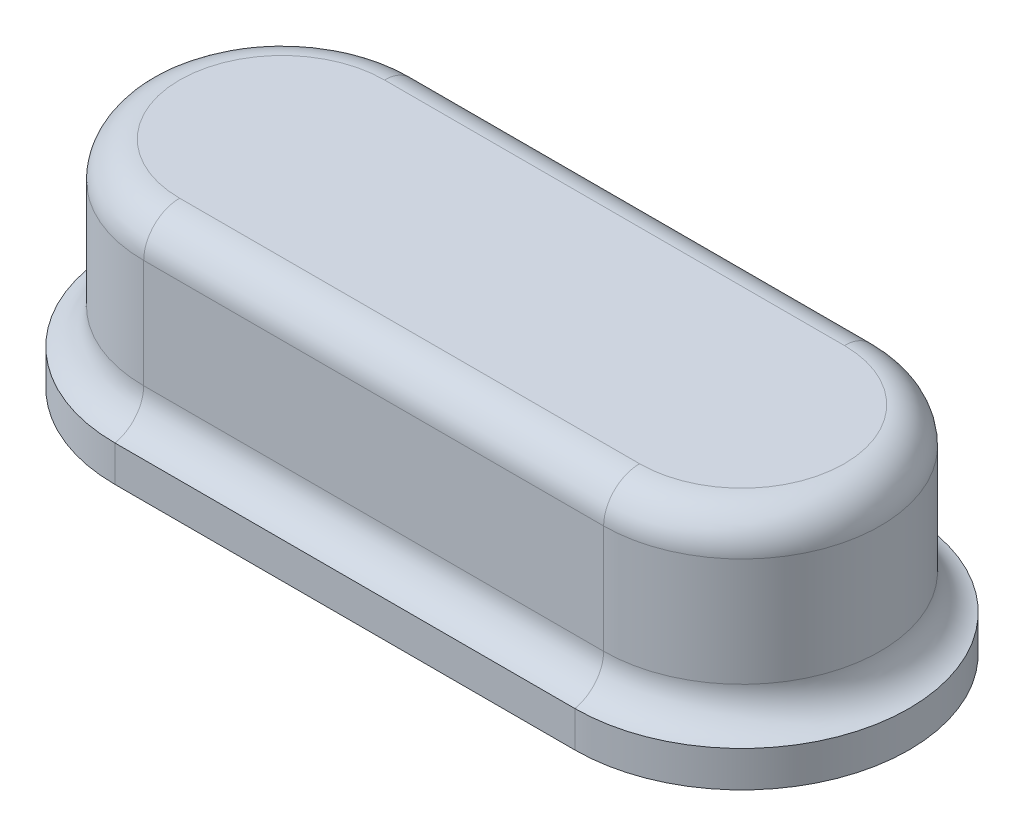
ISO-10303-21;
HEADER;
FILE_DESCRIPTION(('STEP AP214'),'2;1');
FILE_NAME('part.step','',(''),(''),'','','');
FILE_SCHEMA(('AUTOMOTIVE_DESIGN { 1 0 10303 214 1 1 1 1 }'));
ENDSEC;
DATA;
#1=APPLICATION_CONTEXT('core data for automotive mechanical design processes');
#2=APPLICATION_PROTOCOL_DEFINITION('international standard','automotive_design',2000,#1);
#3=PRODUCT_CONTEXT('',#1,'mechanical');
#4=PRODUCT('Part','Part','',(#3));
#5=PRODUCT_RELATED_PRODUCT_CATEGORY('part','',(#4));
#6=PRODUCT_DEFINITION_FORMATION('','',#4);
#7=PRODUCT_DEFINITION_CONTEXT('part definition',#1,'design');
#8=PRODUCT_DEFINITION('design','',#6,#7);
#9=PRODUCT_DEFINITION_SHAPE('','',#8);
#10=(LENGTH_UNIT() NAMED_UNIT(*) SI_UNIT(.MILLI.,.METRE.));
#11=(NAMED_UNIT(*) PLANE_ANGLE_UNIT() SI_UNIT($,.RADIAN.));
#12=(NAMED_UNIT(*) SI_UNIT($,.STERADIAN.) SOLID_ANGLE_UNIT());
#13=UNCERTAINTY_MEASURE_WITH_UNIT(LENGTH_MEASURE(1.E-05),#10,'distance_accuracy_value','');
#14=(GEOMETRIC_REPRESENTATION_CONTEXT(3) GLOBAL_UNCERTAINTY_ASSIGNED_CONTEXT((#13)) GLOBAL_UNIT_ASSIGNED_CONTEXT((#10,
#11,#12)) REPRESENTATION_CONTEXT('',''));
#15=CARTESIAN_POINT('',(0.,0.,0.));
#16=DIRECTION('',(0.,0.,1.));
#17=DIRECTION('',(1.,0.,0.));
#18=AXIS2_PLACEMENT_3D('',#15,#16,#17);
#19=CARTESIAN_POINT('',(-3.2,0.5,0.));
#20=DIRECTION('',(0.,-1.,0.));
#21=DIRECTION('',(0.,0.,-1.));
#22=AXIS2_PLACEMENT_3D('',#19,#20,#21);
#23=CYLINDRICAL_SURFACE('',#22,2.325);
#24=CARTESIAN_POINT('',(-3.2,0.,0.));
#25=DIRECTION('',(0.,1.,0.));
#26=DIRECTION('',(0.,0.,1.));
#27=AXIS2_PLACEMENT_3D('',#24,#25,#26);
#28=CIRCLE('',#27,2.325);
#29=CARTESIAN_POINT('',(-3.2,0.,-2.325));
#30=VERTEX_POINT('',#29);
#31=CARTESIAN_POINT('',(-3.2,0.,2.325));
#32=VERTEX_POINT('',#31);
#33=EDGE_CURVE('E128',#30,#32,#28,.T.);
#34=ORIENTED_EDGE('',*,*,#33,.T.);
#35=DIRECTION('',(0.,-1.,0.));
#36=VECTOR('',#35,1.);
#37=CARTESIAN_POINT('',(-3.2,0.5,2.325));
#38=LINE('',#37,#36);
#39=CARTESIAN_POINT('',(-3.2,0.5,2.325));
#40=VERTEX_POINT('',#39);
#41=EDGE_CURVE('E112',#40,#32,#38,.T.);
#42=ORIENTED_EDGE('',*,*,#41,.F.);
#43=CARTESIAN_POINT('',(-3.2,0.5,0.));
#44=DIRECTION('',(0.,1.,0.));
#45=DIRECTION('',(0.,0.,1.));
#46=AXIS2_PLACEMENT_3D('',#43,#44,#45);
#47=CIRCLE('',#46,2.325);
#48=CARTESIAN_POINT('',(-3.2,0.5,-2.325));
#49=VERTEX_POINT('',#48);
#50=EDGE_CURVE('E121',#49,#40,#47,.T.);
#51=ORIENTED_EDGE('',*,*,#50,.F.);
#52=DIRECTION('',(0.,-1.,0.));
#53=VECTOR('',#52,1.);
#54=CARTESIAN_POINT('',(-3.2,0.5,-2.325));
#55=LINE('',#54,#53);
#56=EDGE_CURVE('E215',#49,#30,#55,.T.);
#57=ORIENTED_EDGE('',*,*,#56,.T.);
#58=EDGE_LOOP('',(#34,#42,#51,#57));
#59=FACE_BOUND('',#58,.T.);
#60=ADVANCED_FACE('F31',(#59),#23,.T.);
#61=CARTESIAN_POINT('',(-3.2,0.5,2.325));
#62=DIRECTION('',(0.,0.,-1.));
#63=DIRECTION('',(-1.,0.,0.));
#64=AXIS2_PLACEMENT_3D('',#61,#62,#63);
#65=PLANE('',#64);
#66=DIRECTION('',(1.,0.,0.));
#67=VECTOR('',#66,1.);
#68=CARTESIAN_POINT('',(-3.2,0.,2.325));
#69=LINE('',#68,#67);
#70=CARTESIAN_POINT('',(3.2,0.,2.325));
#71=VERTEX_POINT('',#70);
#72=EDGE_CURVE('E217',#32,#71,#69,.T.);
#73=ORIENTED_EDGE('',*,*,#72,.T.);
#74=DIRECTION('',(0.,-1.,0.));
#75=VECTOR('',#74,1.);
#76=CARTESIAN_POINT('',(3.2,0.5,2.325));
#77=LINE('',#76,#75);
#78=CARTESIAN_POINT('',(3.2,0.5,2.325));
#79=VERTEX_POINT('',#78);
#80=EDGE_CURVE('E115',#79,#71,#77,.T.);
#81=ORIENTED_EDGE('',*,*,#80,.F.);
#82=DIRECTION('',(1.,0.,0.));
#83=VECTOR('',#82,1.);
#84=CARTESIAN_POINT('',(-3.2,0.5,2.325));
#85=LINE('',#84,#83);
#86=EDGE_CURVE('E109',#40,#79,#85,.T.);
#87=ORIENTED_EDGE('',*,*,#86,.F.);
#88=ORIENTED_EDGE('',*,*,#41,.T.);
#89=EDGE_LOOP('',(#73,#81,#87,#88));
#90=FACE_BOUND('',#89,.T.);
#91=ADVANCED_FACE('F111',(#90),#65,.F.);
#92=CARTESIAN_POINT('',(3.2,0.5,0.));
#93=DIRECTION('',(0.,-1.,0.));
#94=DIRECTION('',(0.,0.,-1.));
#95=AXIS2_PLACEMENT_3D('',#92,#93,#94);
#96=CYLINDRICAL_SURFACE('',#95,2.325);
#97=CARTESIAN_POINT('',(3.2,0.,0.));
#98=DIRECTION('',(0.,1.,0.));
#99=DIRECTION('',(0.,0.,1.));
#100=AXIS2_PLACEMENT_3D('',#97,#98,#99);
#101=CIRCLE('',#100,2.325);
#102=CARTESIAN_POINT('',(3.2,0.,-2.325));
#103=VERTEX_POINT('',#102);
#104=EDGE_CURVE('E219',#71,#103,#101,.T.);
#105=ORIENTED_EDGE('',*,*,#104,.T.);
#106=DIRECTION('',(0.,-1.,0.));
#107=VECTOR('',#106,1.);
#108=CARTESIAN_POINT('',(3.2,0.5,-2.325));
#109=LINE('',#108,#107);
#110=CARTESIAN_POINT('',(3.2,0.5,-2.325));
#111=VERTEX_POINT('',#110);
#112=EDGE_CURVE('E223',#111,#103,#109,.T.);
#113=ORIENTED_EDGE('',*,*,#112,.F.);
#114=CARTESIAN_POINT('',(3.2,0.5,0.));
#115=DIRECTION('',(0.,1.,0.));
#116=DIRECTION('',(0.,0.,1.));
#117=AXIS2_PLACEMENT_3D('',#114,#115,#116);
#118=CIRCLE('',#117,2.325);
#119=EDGE_CURVE('E120',#79,#111,#118,.T.);
#120=ORIENTED_EDGE('',*,*,#119,.F.);
#121=ORIENTED_EDGE('',*,*,#80,.T.);
#122=EDGE_LOOP('',(#105,#113,#120,#121));
#123=FACE_BOUND('',#122,.T.);
#124=ADVANCED_FACE('F256',(#123),#96,.T.);
#125=CARTESIAN_POINT('',(-3.2,0.5,-2.325));
#126=DIRECTION('',(0.,0.,1.));
#127=DIRECTION('',(1.,0.,0.));
#128=AXIS2_PLACEMENT_3D('',#125,#126,#127);
#129=PLANE('',#128);
#130=DIRECTION('',(-1.,0.,0.));
#131=VECTOR('',#130,1.);
#132=CARTESIAN_POINT('',(-3.2,0.,-2.325));
#133=LINE('',#132,#131);
#134=EDGE_CURVE('E140',#103,#30,#133,.T.);
#135=ORIENTED_EDGE('',*,*,#134,.T.);
#136=ORIENTED_EDGE('',*,*,#56,.F.);
#137=DIRECTION('',(-1.,0.,0.));
#138=VECTOR('',#137,1.);
#139=CARTESIAN_POINT('',(-3.2,0.5,-2.325));
#140=LINE('',#139,#138);
#141=EDGE_CURVE('E213',#111,#49,#140,.T.);
#142=ORIENTED_EDGE('',*,*,#141,.F.);
#143=ORIENTED_EDGE('',*,*,#112,.T.);
#144=EDGE_LOOP('',(#135,#136,#142,#143));
#145=FACE_BOUND('',#144,.T.);
#146=ADVANCED_FACE('F248',(#145),#129,.F.);
#147=CARTESIAN_POINT('',(-3.2,0.,0.));
#148=DIRECTION('',(0.,1.,0.));
#149=DIRECTION('',(0.,0.,1.));
#150=AXIS2_PLACEMENT_3D('',#147,#148,#149);
#151=PLANE('',#150);
#152=ORIENTED_EDGE('',*,*,#33,.F.);
#153=ORIENTED_EDGE('',*,*,#134,.F.);
#154=ORIENTED_EDGE('',*,*,#104,.F.);
#155=ORIENTED_EDGE('',*,*,#72,.F.);
#156=EDGE_LOOP('',(#152,#153,#154,#155));
#157=FACE_BOUND('',#156,.T.);
#158=ADVANCED_FACE('F241',(#157),#151,.F.);
#159=CARTESIAN_POINT('',(-3.2,3.,0.));
#160=DIRECTION('',(0.,-1.,0.));
#161=DIRECTION('',(0.,0.,-1.));
#162=AXIS2_PLACEMENT_3D('',#159,#160,#161);
#163=CYLINDRICAL_SURFACE('',#162,1.925);
#164=DIRECTION('',(0.,-1.,0.));
#165=VECTOR('',#164,1.);
#166=CARTESIAN_POINT('',(-3.2,3.,1.925));
#167=LINE('',#166,#165);
#168=CARTESIAN_POINT('',(-3.2,2.5,1.925));
#169=VERTEX_POINT('',#168);
#170=CARTESIAN_POINT('',(-3.2,0.989897948556636,1.925));
#171=VERTEX_POINT('',#170);
#172=EDGE_CURVE('E206',#169,#171,#167,.T.);
#173=ORIENTED_EDGE('',*,*,#172,.F.);
#174=CARTESIAN_POINT('',(-3.2,2.5,0.));
#175=DIRECTION('',(0.,1.,0.));
#176=DIRECTION('',(0.,0.,1.));
#177=AXIS2_PLACEMENT_3D('',#174,#175,#176);
#178=CIRCLE('',#177,1.925);
#179=CARTESIAN_POINT('',(-3.2,2.5,-1.925));
#180=VERTEX_POINT('',#179);
#181=EDGE_CURVE('E11',#169,#180,#178,.F.);
#182=ORIENTED_EDGE('',*,*,#181,.T.);
#183=DIRECTION('',(0.,-1.,0.));
#184=VECTOR('',#183,1.);
#185=CARTESIAN_POINT('',(-3.2,3.,-1.925));
#186=LINE('',#185,#184);
#187=CARTESIAN_POINT('',(-3.2,0.989897948556636,-1.925));
#188=VERTEX_POINT('',#187);
#189=EDGE_CURVE('E158',#180,#188,#186,.T.);
#190=ORIENTED_EDGE('',*,*,#189,.T.);
#191=CARTESIAN_POINT('',(-3.2,0.989897948556636,0.));
#192=DIRECTION('',(0.,-1.,0.));
#193=DIRECTION('',(0.,0.,-1.));
#194=AXIS2_PLACEMENT_3D('',#191,#192,#193);
#195=CIRCLE('',#194,1.925);
#196=EDGE_CURVE('E129',#188,#171,#195,.F.);
#197=ORIENTED_EDGE('',*,*,#196,.T.);
#198=EDGE_LOOP('',(#173,#182,#190,#197));
#199=FACE_BOUND('',#198,.T.);
#200=ADVANCED_FACE('F239',(#199),#163,.T.);
#201=CARTESIAN_POINT('',(-3.2,3.,1.925));
#202=DIRECTION('',(0.,0.,-1.));
#203=DIRECTION('',(-1.,0.,0.));
#204=AXIS2_PLACEMENT_3D('',#201,#202,#203);
#205=PLANE('',#204);
#206=DIRECTION('',(0.,-1.,0.));
#207=VECTOR('',#206,1.);
#208=CARTESIAN_POINT('',(3.2,3.,1.925));
#209=LINE('',#208,#207);
#210=CARTESIAN_POINT('',(3.2,2.5,1.925));
#211=VERTEX_POINT('',#210);
#212=CARTESIAN_POINT('',(3.2,0.989897948556636,1.925));
#213=VERTEX_POINT('',#212);
#214=EDGE_CURVE('E204',#211,#213,#209,.T.);
#215=ORIENTED_EDGE('',*,*,#214,.F.);
#216=DIRECTION('',(1.,0.,0.));
#217=VECTOR('',#216,1.);
#218=CARTESIAN_POINT('',(-3.2,2.5,1.925));
#219=LINE('',#218,#217);
#220=EDGE_CURVE('E40',#211,#169,#219,.F.);
#221=ORIENTED_EDGE('',*,*,#220,.T.);
#222=ORIENTED_EDGE('',*,*,#172,.T.);
#223=DIRECTION('',(-1.,0.,0.));
#224=VECTOR('',#223,1.);
#225=CARTESIAN_POINT('',(-3.2,0.989897948556636,1.925));
#226=LINE('',#225,#224);
#227=EDGE_CURVE('E144',#171,#213,#226,.F.);
#228=ORIENTED_EDGE('',*,*,#227,.T.);
#229=EDGE_LOOP('',(#215,#221,#222,#228));
#230=FACE_BOUND('',#229,.T.);
#231=ADVANCED_FACE('F229',(#230),#205,.F.);
#232=CARTESIAN_POINT('',(3.2,3.,0.));
#233=DIRECTION('',(0.,-1.,0.));
#234=DIRECTION('',(0.,0.,-1.));
#235=AXIS2_PLACEMENT_3D('',#232,#233,#234);
#236=CYLINDRICAL_SURFACE('',#235,1.925);
#237=DIRECTION('',(0.,-1.,0.));
#238=VECTOR('',#237,1.);
#239=CARTESIAN_POINT('',(3.2,3.,-1.925));
#240=LINE('',#239,#238);
#241=CARTESIAN_POINT('',(3.2,2.5,-1.925));
#242=VERTEX_POINT('',#241);
#243=CARTESIAN_POINT('',(3.2,0.989897948556636,-1.925));
#244=VERTEX_POINT('',#243);
#245=EDGE_CURVE('E198',#242,#244,#240,.T.);
#246=ORIENTED_EDGE('',*,*,#245,.F.);
#247=CARTESIAN_POINT('',(3.2,2.5,0.));
#248=DIRECTION('',(0.,1.,0.));
#249=DIRECTION('',(0.,0.,1.));
#250=AXIS2_PLACEMENT_3D('',#247,#248,#249);
#251=CIRCLE('',#250,1.925);
#252=EDGE_CURVE('E55',#242,#211,#251,.F.);
#253=ORIENTED_EDGE('',*,*,#252,.T.);
#254=ORIENTED_EDGE('',*,*,#214,.T.);
#255=CARTESIAN_POINT('',(3.2,0.989897948556636,0.));
#256=DIRECTION('',(0.,-1.,0.));
#257=DIRECTION('',(0.,0.,-1.));
#258=AXIS2_PLACEMENT_3D('',#255,#256,#257);
#259=CIRCLE('',#258,1.925);
#260=EDGE_CURVE('E202',#213,#244,#259,.F.);
#261=ORIENTED_EDGE('',*,*,#260,.T.);
#262=EDGE_LOOP('',(#246,#253,#254,#261));
#263=FACE_BOUND('',#262,.T.);
#264=ADVANCED_FACE('F200',(#263),#236,.T.);
#265=CARTESIAN_POINT('',(3.2,3.,-1.925));
#266=DIRECTION('',(0.,0.,1.));
#267=DIRECTION('',(1.,0.,0.));
#268=AXIS2_PLACEMENT_3D('',#265,#266,#267);
#269=PLANE('',#268);
#270=ORIENTED_EDGE('',*,*,#189,.F.);
#271=DIRECTION('',(-1.,0.,0.));
#272=VECTOR('',#271,1.);
#273=CARTESIAN_POINT('',(3.2,2.5,-1.925));
#274=LINE('',#273,#272);
#275=EDGE_CURVE('E168',#180,#242,#274,.F.);
#276=ORIENTED_EDGE('',*,*,#275,.T.);
#277=ORIENTED_EDGE('',*,*,#245,.T.);
#278=DIRECTION('',(1.,0.,0.));
#279=VECTOR('',#278,1.);
#280=CARTESIAN_POINT('',(3.2,0.989897948556636,-1.925));
#281=LINE('',#280,#279);
#282=EDGE_CURVE('E228',#244,#188,#281,.F.);
#283=ORIENTED_EDGE('',*,*,#282,.T.);
#284=EDGE_LOOP('',(#270,#276,#277,#283));
#285=FACE_BOUND('',#284,.T.);
#286=ADVANCED_FACE('F196',(#285),#269,.F.);
#287=CARTESIAN_POINT('',(-3.2,3.,0.));
#288=DIRECTION('',(0.,1.,0.));
#289=DIRECTION('',(0.,0.,1.));
#290=AXIS2_PLACEMENT_3D('',#287,#288,#289);
#291=PLANE('',#290);
#292=CARTESIAN_POINT('',(3.2,3.,0.));
#293=DIRECTION('',(0.,1.,0.));
#294=DIRECTION('',(0.,0.,1.));
#295=AXIS2_PLACEMENT_3D('',#292,#293,#294);
#296=CIRCLE('',#295,1.425);
#297=CARTESIAN_POINT('',(3.2,3.,1.425));
#298=VERTEX_POINT('',#297);
#299=CARTESIAN_POINT('',(3.2,3.,-1.425));
#300=VERTEX_POINT('',#299);
#301=EDGE_CURVE('E163',#298,#300,#296,.T.);
#302=ORIENTED_EDGE('',*,*,#301,.T.);
#303=DIRECTION('',(-1.,0.,0.));
#304=VECTOR('',#303,1.);
#305=CARTESIAN_POINT('',(-3.2,3.,-1.425));
#306=LINE('',#305,#304);
#307=CARTESIAN_POINT('',(-3.2,3.,-1.425));
#308=VERTEX_POINT('',#307);
#309=EDGE_CURVE('E165',#300,#308,#306,.T.);
#310=ORIENTED_EDGE('',*,*,#309,.T.);
#311=CARTESIAN_POINT('',(-3.2,3.,0.));
#312=DIRECTION('',(0.,1.,0.));
#313=DIRECTION('',(0.,0.,1.));
#314=AXIS2_PLACEMENT_3D('',#311,#312,#313);
#315=CIRCLE('',#314,1.425);
#316=CARTESIAN_POINT('',(-3.2,3.,1.425));
#317=VERTEX_POINT('',#316);
#318=EDGE_CURVE('E159',#308,#317,#315,.T.);
#319=ORIENTED_EDGE('',*,*,#318,.T.);
#320=DIRECTION('',(1.,0.,0.));
#321=VECTOR('',#320,1.);
#322=CARTESIAN_POINT('',(3.2,3.,1.425));
#323=LINE('',#322,#321);
#324=EDGE_CURVE('E161',#317,#298,#323,.T.);
#325=ORIENTED_EDGE('',*,*,#324,.T.);
#326=EDGE_LOOP('',(#302,#310,#319,#325));
#327=FACE_BOUND('',#326,.T.);
#328=ADVANCED_FACE('F188',(#327),#291,.T.);
#329=CARTESIAN_POINT('',(3.2,0.989897948556636,0.));
#330=DIRECTION('',(0.,-1.,0.));
#331=DIRECTION('',(0.,0.,-1.));
#332=AXIS2_PLACEMENT_3D('',#329,#330,#331);
#333=TOROIDAL_SURFACE('',#332,2.425,0.5);
#334=CARTESIAN_POINT('',(3.2,0.98989794855729,2.425));
#335=DIRECTION('',(1.,0.,0.));
#336=DIRECTION('',(0.,0.,-1.));
#337=AXIS2_PLACEMENT_3D('',#334,#335,#336);
#338=CIRCLE('',#337,0.5);
#339=EDGE_CURVE('E147',#79,#213,#338,.T.);
#340=ORIENTED_EDGE('',*,*,#339,.F.);
#341=ORIENTED_EDGE('',*,*,#119,.T.);
#342=CARTESIAN_POINT('',(3.2,0.989897948556636,-2.425));
#343=DIRECTION('',(1.,0.,0.));
#344=DIRECTION('',(0.,0.,-1.));
#345=AXIS2_PLACEMENT_3D('',#342,#343,#344);
#346=CIRCLE('',#345,0.5);
#347=EDGE_CURVE('E155',#244,#111,#346,.T.);
#348=ORIENTED_EDGE('',*,*,#347,.F.);
#349=ORIENTED_EDGE('',*,*,#260,.F.);
#350=EDGE_LOOP('',(#340,#341,#348,#349));
#351=FACE_BOUND('',#350,.T.);
#352=ADVANCED_FACE('F232',(#351),#333,.F.);
#353=CARTESIAN_POINT('',(-3.2,0.989897948556636,-2.425));
#354=DIRECTION('',(1.,0.,0.));
#355=DIRECTION('',(0.,0.,-1.));
#356=AXIS2_PLACEMENT_3D('',#353,#354,#355);
#357=CYLINDRICAL_SURFACE('',#356,0.5);
#358=ORIENTED_EDGE('',*,*,#347,.T.);
#359=ORIENTED_EDGE('',*,*,#141,.T.);
#360=CARTESIAN_POINT('',(-3.2,0.989897948556636,-2.425));
#361=DIRECTION('',(1.,0.,0.));
#362=DIRECTION('',(0.,0.,-1.));
#363=AXIS2_PLACEMENT_3D('',#360,#361,#362);
#364=CIRCLE('',#363,0.5);
#365=EDGE_CURVE('E138',#188,#49,#364,.T.);
#366=ORIENTED_EDGE('',*,*,#365,.F.);
#367=ORIENTED_EDGE('',*,*,#282,.F.);
#368=EDGE_LOOP('',(#358,#359,#366,#367));
#369=FACE_BOUND('',#368,.T.);
#370=ADVANCED_FACE('F235',(#369),#357,.F.);
#371=CARTESIAN_POINT('',(-3.2,0.989897948556636,2.425));
#372=DIRECTION('',(-1.,0.,0.));
#373=DIRECTION('',(0.,0.,1.));
#374=AXIS2_PLACEMENT_3D('',#371,#372,#373);
#375=CYLINDRICAL_SURFACE('',#374,0.5);
#376=ORIENTED_EDGE('',*,*,#339,.T.);
#377=ORIENTED_EDGE('',*,*,#227,.F.);
#378=CARTESIAN_POINT('',(-3.2,0.98989794855729,2.425));
#379=DIRECTION('',(1.,0.,0.));
#380=DIRECTION('',(0.,0.,-1.));
#381=AXIS2_PLACEMENT_3D('',#378,#379,#380);
#382=CIRCLE('',#381,0.5);
#383=EDGE_CURVE('E135',#40,#171,#382,.T.);
#384=ORIENTED_EDGE('',*,*,#383,.F.);
#385=ORIENTED_EDGE('',*,*,#86,.T.);
#386=EDGE_LOOP('',(#376,#377,#384,#385));
#387=FACE_BOUND('',#386,.T.);
#388=ADVANCED_FACE('F142',(#387),#375,.F.);
#389=CARTESIAN_POINT('',(-3.2,0.989897948556636,0.));
#390=DIRECTION('',(0.,-1.,0.));
#391=DIRECTION('',(0.,0.,-1.));
#392=AXIS2_PLACEMENT_3D('',#389,#390,#391);
#393=TOROIDAL_SURFACE('',#392,2.425,0.5);
#394=ORIENTED_EDGE('',*,*,#365,.T.);
#395=ORIENTED_EDGE('',*,*,#50,.T.);
#396=ORIENTED_EDGE('',*,*,#383,.T.);
#397=ORIENTED_EDGE('',*,*,#196,.F.);
#398=EDGE_LOOP('',(#394,#395,#396,#397));
#399=FACE_BOUND('',#398,.T.);
#400=ADVANCED_FACE('F133',(#399),#393,.F.);
#401=CARTESIAN_POINT('',(-3.2,2.5,1.425));
#402=DIRECTION('',(-1.,0.,0.));
#403=DIRECTION('',(0.,0.,1.));
#404=AXIS2_PLACEMENT_3D('',#401,#402,#403);
#405=CYLINDRICAL_SURFACE('',#404,0.5);
#406=CARTESIAN_POINT('',(-3.2,2.5,1.425));
#407=DIRECTION('',(-1.,0.,0.));
#408=DIRECTION('',(0.,0.,1.));
#409=AXIS2_PLACEMENT_3D('',#406,#407,#408);
#410=CIRCLE('',#409,0.5);
#411=EDGE_CURVE('E150',#169,#317,#410,.T.);
#412=ORIENTED_EDGE('',*,*,#411,.F.);
#413=ORIENTED_EDGE('',*,*,#220,.F.);
#414=CARTESIAN_POINT('',(3.2,2.5,1.425));
#415=DIRECTION('',(1.,0.,0.));
#416=DIRECTION('',(0.,0.,-1.));
#417=AXIS2_PLACEMENT_3D('',#414,#415,#416);
#418=CIRCLE('',#417,0.5);
#419=EDGE_CURVE('E35',#298,#211,#418,.T.);
#420=ORIENTED_EDGE('',*,*,#419,.F.);
#421=ORIENTED_EDGE('',*,*,#324,.F.);
#422=EDGE_LOOP('',(#412,#413,#420,#421));
#423=FACE_BOUND('',#422,.T.);
#424=ADVANCED_FACE('F33',(#423),#405,.T.);
#425=CARTESIAN_POINT('',(3.2,2.5,0.));
#426=DIRECTION('',(0.,1.,0.));
#427=DIRECTION('',(0.,0.,1.));
#428=AXIS2_PLACEMENT_3D('',#425,#426,#427);
#429=TOROIDAL_SURFACE('',#428,1.425,0.5);
#430=ORIENTED_EDGE('',*,*,#419,.T.);
#431=ORIENTED_EDGE('',*,*,#252,.F.);
#432=CARTESIAN_POINT('',(3.2,2.5,-1.425));
#433=DIRECTION('',(-1.,0.,0.));
#434=DIRECTION('',(0.,0.,1.));
#435=AXIS2_PLACEMENT_3D('',#432,#433,#434);
#436=CIRCLE('',#435,0.5);
#437=EDGE_CURVE('E175',#300,#242,#436,.T.);
#438=ORIENTED_EDGE('',*,*,#437,.F.);
#439=ORIENTED_EDGE('',*,*,#301,.F.);
#440=EDGE_LOOP('',(#430,#431,#438,#439));
#441=FACE_BOUND('',#440,.T.);
#442=ADVANCED_FACE('F271',(#441),#429,.T.);
#443=CARTESIAN_POINT('',(-3.2,2.5,0.));
#444=DIRECTION('',(0.,1.,0.));
#445=DIRECTION('',(0.,0.,1.));
#446=AXIS2_PLACEMENT_3D('',#443,#444,#445);
#447=TOROIDAL_SURFACE('',#446,1.425,0.5);
#448=ORIENTED_EDGE('',*,*,#411,.T.);
#449=ORIENTED_EDGE('',*,*,#318,.F.);
#450=CARTESIAN_POINT('',(-3.2,2.5,-1.425));
#451=DIRECTION('',(1.,0.,0.));
#452=DIRECTION('',(0.,0.,-1.));
#453=AXIS2_PLACEMENT_3D('',#450,#451,#452);
#454=CIRCLE('',#453,0.5);
#455=EDGE_CURVE('E173',#180,#308,#454,.T.);
#456=ORIENTED_EDGE('',*,*,#455,.F.);
#457=ORIENTED_EDGE('',*,*,#181,.F.);
#458=EDGE_LOOP('',(#448,#449,#456,#457));
#459=FACE_BOUND('',#458,.T.);
#460=ADVANCED_FACE('F181',(#459),#447,.T.);
#461=CARTESIAN_POINT('',(-3.2,2.5,-1.425));
#462=DIRECTION('',(1.,0.,0.));
#463=DIRECTION('',(0.,0.,-1.));
#464=AXIS2_PLACEMENT_3D('',#461,#462,#463);
#465=CYLINDRICAL_SURFACE('',#464,0.5);
#466=ORIENTED_EDGE('',*,*,#437,.T.);
#467=ORIENTED_EDGE('',*,*,#275,.F.);
#468=ORIENTED_EDGE('',*,*,#455,.T.);
#469=ORIENTED_EDGE('',*,*,#309,.F.);
#470=EDGE_LOOP('',(#466,#467,#468,#469));
#471=FACE_BOUND('',#470,.T.);
#472=ADVANCED_FACE('F192',(#471),#465,.T.);
#473=CLOSED_SHELL('',(#60,#91,#124,#146,#158,#200,#231,#264,#286,#328,#352,#370,#388,#400,#424,
#442,#460,#472));
#474=MANIFOLD_SOLID_BREP('B2',#473);
#475=ADVANCED_BREP_SHAPE_REPRESENTATION('',(#18,#474),#14);
#476=SHAPE_DEFINITION_REPRESENTATION(#9,#475);
ENDSEC;
END-ISO-10303-21;
